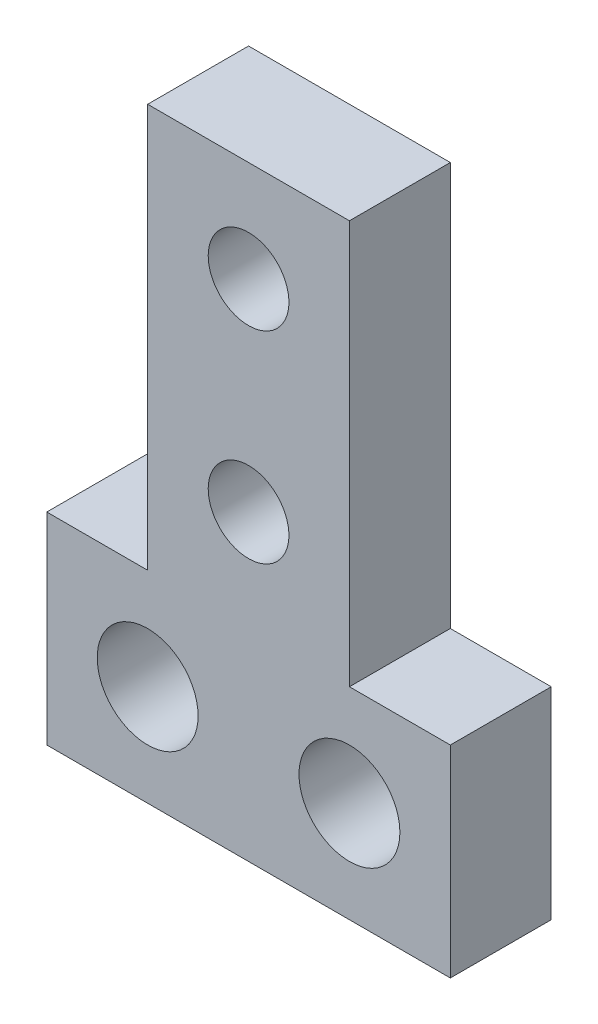
ISO-10303-21;
HEADER;
FILE_DESCRIPTION(('STEP AP214'),'2;1');
FILE_NAME('part.step','',(''),(''),'','','');
FILE_SCHEMA(('AUTOMOTIVE_DESIGN { 1 0 10303 214 1 1 1 1 }'));
ENDSEC;
DATA;
#1=APPLICATION_CONTEXT('core data for automotive mechanical design processes');
#2=APPLICATION_PROTOCOL_DEFINITION('international standard','automotive_design',2000,#1);
#3=PRODUCT_CONTEXT('',#1,'mechanical');
#4=PRODUCT('Part','Part','',(#3));
#5=PRODUCT_RELATED_PRODUCT_CATEGORY('part','',(#4));
#6=PRODUCT_DEFINITION_FORMATION('','',#4);
#7=PRODUCT_DEFINITION_CONTEXT('part definition',#1,'design');
#8=PRODUCT_DEFINITION('design','',#6,#7);
#9=PRODUCT_DEFINITION_SHAPE('','',#8);
#10=(LENGTH_UNIT() NAMED_UNIT(*) SI_UNIT(.MILLI.,.METRE.));
#11=(NAMED_UNIT(*) PLANE_ANGLE_UNIT() SI_UNIT($,.RADIAN.));
#12=(NAMED_UNIT(*) SI_UNIT($,.STERADIAN.) SOLID_ANGLE_UNIT());
#13=UNCERTAINTY_MEASURE_WITH_UNIT(LENGTH_MEASURE(1.E-05),#10,'distance_accuracy_value','');
#14=(GEOMETRIC_REPRESENTATION_CONTEXT(3) GLOBAL_UNCERTAINTY_ASSIGNED_CONTEXT((#13)) GLOBAL_UNIT_ASSIGNED_CONTEXT((#10,
#11,#12)) REPRESENTATION_CONTEXT('',''));
#15=CARTESIAN_POINT('',(0.,0.,0.));
#16=DIRECTION('',(0.,0.,1.));
#17=DIRECTION('',(1.,0.,0.));
#18=AXIS2_PLACEMENT_3D('',#15,#16,#17);
#19=CARTESIAN_POINT('',(10.,5.,5.));
#20=DIRECTION('',(0.,-1.,0.));
#21=DIRECTION('',(1.,0.,0.));
#22=AXIS2_PLACEMENT_3D('',#19,#20,#21);
#23=PLANE('',#22);
#24=DIRECTION('',(0.,0.,-1.));
#25=VECTOR('',#24,1.);
#26=CARTESIAN_POINT('',(5.,5.,5.));
#27=LINE('',#26,#25);
#28=CARTESIAN_POINT('',(5.,5.,5.));
#29=VERTEX_POINT('',#28);
#30=CARTESIAN_POINT('',(5.,5.,0.));
#31=VERTEX_POINT('',#30);
#32=EDGE_CURVE('E141',#29,#31,#27,.T.);
#33=ORIENTED_EDGE('',*,*,#32,.F.);
#34=DIRECTION('',(-1.,0.,0.));
#35=VECTOR('',#34,1.);
#36=CARTESIAN_POINT('',(10.,5.,5.));
#37=LINE('',#36,#35);
#38=CARTESIAN_POINT('',(10.,5.,5.));
#39=VERTEX_POINT('',#38);
#40=EDGE_CURVE('E162',#39,#29,#37,.T.);
#41=ORIENTED_EDGE('',*,*,#40,.F.);
#42=DIRECTION('',(0.,0.,-1.));
#43=VECTOR('',#42,1.);
#44=CARTESIAN_POINT('',(10.,5.,5.));
#45=LINE('',#44,#43);
#46=CARTESIAN_POINT('',(10.,5.,0.));
#47=VERTEX_POINT('',#46);
#48=EDGE_CURVE('E174',#39,#47,#45,.T.);
#49=ORIENTED_EDGE('',*,*,#48,.T.);
#50=DIRECTION('',(-1.,0.,0.));
#51=VECTOR('',#50,1.);
#52=CARTESIAN_POINT('',(10.,5.,0.));
#53=LINE('',#52,#51);
#54=EDGE_CURVE('E158',#47,#31,#53,.T.);
#55=ORIENTED_EDGE('',*,*,#54,.T.);
#56=EDGE_LOOP('',(#33,#41,#49,#55));
#57=FACE_BOUND('',#56,.T.);
#58=ADVANCED_FACE('F35',(#57),#23,.F.);
#59=CARTESIAN_POINT('',(0.,0.,5.));
#60=DIRECTION('',(0.,0.,1.));
#61=DIRECTION('',(1.,0.,0.));
#62=AXIS2_PLACEMENT_3D('',#59,#60,#61);
#63=PLANE('',#62);
#64=CARTESIAN_POINT('',(-5.,0.,5.));
#65=DIRECTION('',(0.,0.,1.));
#66=DIRECTION('',(1.,0.,0.));
#67=AXIS2_PLACEMENT_3D('',#64,#65,#66);
#68=CIRCLE('',#67,2.5);
#69=CARTESIAN_POINT('',(-2.5,0.,5.));
#70=VERTEX_POINT('',#69);
#71=EDGE_CURVE('E150',#70,#70,#68,.T.);
#72=ORIENTED_EDGE('',*,*,#71,.F.);
#73=EDGE_LOOP('',(#72));
#74=FACE_BOUND('',#73,.T.);
#75=DIRECTION('',(0.,-1.,0.));
#76=VECTOR('',#75,1.);
#77=CARTESIAN_POINT('',(-9.99999999999999,-5.,5.));
#78=LINE('',#77,#76);
#79=CARTESIAN_POINT('',(-9.99999999999999,5.,5.));
#80=VERTEX_POINT('',#79);
#81=CARTESIAN_POINT('',(-9.99999999999999,-5.,5.));
#82=VERTEX_POINT('',#81);
#83=EDGE_CURVE('E156',#80,#82,#78,.T.);
#84=ORIENTED_EDGE('',*,*,#83,.T.);
#85=DIRECTION('',(1.,0.,0.));
#86=VECTOR('',#85,1.);
#87=CARTESIAN_POINT('',(10.,-5.,5.));
#88=LINE('',#87,#86);
#89=CARTESIAN_POINT('',(10.,-5.,5.));
#90=VERTEX_POINT('',#89);
#91=EDGE_CURVE('E87',#82,#90,#88,.T.);
#92=ORIENTED_EDGE('',*,*,#91,.T.);
#93=DIRECTION('',(0.,1.,0.));
#94=VECTOR('',#93,1.);
#95=CARTESIAN_POINT('',(10.,-5.,5.));
#96=LINE('',#95,#94);
#97=EDGE_CURVE('E160',#90,#39,#96,.T.);
#98=ORIENTED_EDGE('',*,*,#97,.T.);
#99=ORIENTED_EDGE('',*,*,#40,.T.);
#100=DIRECTION('',(0.,-1.,0.));
#101=VECTOR('',#100,1.);
#102=CARTESIAN_POINT('',(5.,5.,5.));
#103=LINE('',#102,#101);
#104=CARTESIAN_POINT('',(5.,25.,5.));
#105=VERTEX_POINT('',#104);
#106=EDGE_CURVE('E117',#105,#29,#103,.T.);
#107=ORIENTED_EDGE('',*,*,#106,.F.);
#108=DIRECTION('',(1.,0.,0.));
#109=VECTOR('',#108,1.);
#110=CARTESIAN_POINT('',(-5.,25.,5.));
#111=LINE('',#110,#109);
#112=CARTESIAN_POINT('',(-5.,25.,5.));
#113=VERTEX_POINT('',#112);
#114=EDGE_CURVE('E112',#113,#105,#111,.T.);
#115=ORIENTED_EDGE('',*,*,#114,.F.);
#116=DIRECTION('',(0.,1.,0.));
#117=VECTOR('',#116,1.);
#118=CARTESIAN_POINT('',(-5.,5.,5.));
#119=LINE('',#118,#117);
#120=CARTESIAN_POINT('',(-5.,5.,5.));
#121=VERTEX_POINT('',#120);
#122=EDGE_CURVE('E122',#121,#113,#119,.T.);
#123=ORIENTED_EDGE('',*,*,#122,.F.);
#124=EDGE_CURVE('E59',#121,#80,#37,.T.);
#125=ORIENTED_EDGE('',*,*,#124,.T.);
#126=EDGE_LOOP('',(#84,#92,#98,#99,#107,#115,#123,#125));
#127=FACE_BOUND('',#126,.T.);
#128=CARTESIAN_POINT('',(5.,0.,5.));
#129=DIRECTION('',(0.,0.,1.));
#130=DIRECTION('',(1.,0.,0.));
#131=AXIS2_PLACEMENT_3D('',#128,#129,#130);
#132=CIRCLE('',#131,2.5);
#133=CARTESIAN_POINT('',(7.5,0.,5.));
#134=VERTEX_POINT('',#133);
#135=EDGE_CURVE('E144',#134,#134,#132,.T.);
#136=ORIENTED_EDGE('',*,*,#135,.F.);
#137=EDGE_LOOP('',(#136));
#138=FACE_BOUND('',#137,.T.);
#139=CARTESIAN_POINT('',(0.,10.,5.));
#140=DIRECTION('',(0.,0.,-1.));
#141=DIRECTION('',(-1.,0.,0.));
#142=AXIS2_PLACEMENT_3D('',#139,#140,#141);
#143=CIRCLE('',#142,2.);
#144=CARTESIAN_POINT('',(-2.,10.,5.));
#145=VERTEX_POINT('',#144);
#146=EDGE_CURVE('E323',#145,#145,#143,.T.);
#147=ORIENTED_EDGE('',*,*,#146,.T.);
#148=EDGE_LOOP('',(#147));
#149=FACE_BOUND('',#148,.T.);
#150=CARTESIAN_POINT('',(0.,20.,5.));
#151=DIRECTION('',(0.,0.,-1.));
#152=DIRECTION('',(-1.,0.,0.));
#153=AXIS2_PLACEMENT_3D('',#150,#151,#152);
#154=CIRCLE('',#153,2.);
#155=CARTESIAN_POINT('',(-2.,20.,5.));
#156=VERTEX_POINT('',#155);
#157=EDGE_CURVE('E137',#156,#156,#154,.T.);
#158=ORIENTED_EDGE('',*,*,#157,.T.);
#159=EDGE_LOOP('',(#158));
#160=FACE_BOUND('',#159,.T.);
#161=ADVANCED_FACE('F120',(#74,#127,#138,#149,#160),#63,.T.);
#162=CARTESIAN_POINT('',(0.,0.,0.));
#163=DIRECTION('',(0.,0.,1.));
#164=DIRECTION('',(1.,0.,0.));
#165=AXIS2_PLACEMENT_3D('',#162,#163,#164);
#166=PLANE('',#165);
#167=DIRECTION('',(0.,-1.,0.));
#168=VECTOR('',#167,1.);
#169=CARTESIAN_POINT('',(-9.99999999999999,-5.,0.));
#170=LINE('',#169,#168);
#171=CARTESIAN_POINT('',(-9.99999999999999,5.,0.));
#172=VERTEX_POINT('',#171);
#173=CARTESIAN_POINT('',(-9.99999999999999,-5.,0.));
#174=VERTEX_POINT('',#173);
#175=EDGE_CURVE('E153',#172,#174,#170,.T.);
#176=ORIENTED_EDGE('',*,*,#175,.F.);
#177=CARTESIAN_POINT('',(-5.,5.,0.));
#178=VERTEX_POINT('',#177);
#179=EDGE_CURVE('E80',#178,#172,#53,.T.);
#180=ORIENTED_EDGE('',*,*,#179,.F.);
#181=DIRECTION('',(0.,1.,0.));
#182=VECTOR('',#181,1.);
#183=CARTESIAN_POINT('',(-5.,5.,0.));
#184=LINE('',#183,#182);
#185=CARTESIAN_POINT('',(-5.,25.,0.));
#186=VERTEX_POINT('',#185);
#187=EDGE_CURVE('E50',#178,#186,#184,.T.);
#188=ORIENTED_EDGE('',*,*,#187,.T.);
#189=DIRECTION('',(1.,0.,0.));
#190=VECTOR('',#189,1.);
#191=CARTESIAN_POINT('',(-5.,25.,0.));
#192=LINE('',#191,#190);
#193=CARTESIAN_POINT('',(5.,25.,0.));
#194=VERTEX_POINT('',#193);
#195=EDGE_CURVE('E114',#186,#194,#192,.T.);
#196=ORIENTED_EDGE('',*,*,#195,.T.);
#197=DIRECTION('',(0.,-1.,0.));
#198=VECTOR('',#197,1.);
#199=CARTESIAN_POINT('',(5.,5.,0.));
#200=LINE('',#199,#198);
#201=EDGE_CURVE('E127',#194,#31,#200,.T.);
#202=ORIENTED_EDGE('',*,*,#201,.T.);
#203=ORIENTED_EDGE('',*,*,#54,.F.);
#204=DIRECTION('',(0.,1.,0.));
#205=VECTOR('',#204,1.);
#206=CARTESIAN_POINT('',(10.,-5.,0.));
#207=LINE('',#206,#205);
#208=CARTESIAN_POINT('',(10.,-5.,0.));
#209=VERTEX_POINT('',#208);
#210=EDGE_CURVE('E169',#209,#47,#207,.T.);
#211=ORIENTED_EDGE('',*,*,#210,.F.);
#212=DIRECTION('',(1.,0.,0.));
#213=VECTOR('',#212,1.);
#214=CARTESIAN_POINT('',(10.,-5.,0.));
#215=LINE('',#214,#213);
#216=EDGE_CURVE('E167',#174,#209,#215,.T.);
#217=ORIENTED_EDGE('',*,*,#216,.F.);
#218=EDGE_LOOP('',(#176,#180,#188,#196,#202,#203,#211,#217));
#219=FACE_BOUND('',#218,.T.);
#220=CARTESIAN_POINT('',(-5.,0.,0.));
#221=DIRECTION('',(0.,0.,1.));
#222=DIRECTION('',(1.,0.,0.));
#223=AXIS2_PLACEMENT_3D('',#220,#221,#222);
#224=CIRCLE('',#223,2.5);
#225=CARTESIAN_POINT('',(-2.5,0.,0.));
#226=VERTEX_POINT('',#225);
#227=EDGE_CURVE('E147',#226,#226,#224,.T.);
#228=ORIENTED_EDGE('',*,*,#227,.T.);
#229=EDGE_LOOP('',(#228));
#230=FACE_BOUND('',#229,.T.);
#231=CARTESIAN_POINT('',(5.,0.,0.));
#232=DIRECTION('',(0.,0.,1.));
#233=DIRECTION('',(1.,0.,0.));
#234=AXIS2_PLACEMENT_3D('',#231,#232,#233);
#235=CIRCLE('',#234,2.5);
#236=CARTESIAN_POINT('',(7.5,0.,0.));
#237=VERTEX_POINT('',#236);
#238=EDGE_CURVE('E140',#237,#237,#235,.T.);
#239=ORIENTED_EDGE('',*,*,#238,.T.);
#240=EDGE_LOOP('',(#239));
#241=FACE_BOUND('',#240,.T.);
#242=CARTESIAN_POINT('',(0.,10.,0.));
#243=DIRECTION('',(0.,0.,-1.));
#244=DIRECTION('',(-1.,0.,0.));
#245=AXIS2_PLACEMENT_3D('',#242,#243,#244);
#246=CIRCLE('',#245,2.);
#247=CARTESIAN_POINT('',(-2.,10.,0.));
#248=VERTEX_POINT('',#247);
#249=EDGE_CURVE('E326',#248,#248,#246,.T.);
#250=ORIENTED_EDGE('',*,*,#249,.F.);
#251=EDGE_LOOP('',(#250));
#252=FACE_BOUND('',#251,.T.);
#253=CARTESIAN_POINT('',(0.,20.,0.));
#254=DIRECTION('',(0.,0.,-1.));
#255=DIRECTION('',(-1.,0.,0.));
#256=AXIS2_PLACEMENT_3D('',#253,#254,#255);
#257=CIRCLE('',#256,2.);
#258=CARTESIAN_POINT('',(-2.,20.,0.));
#259=VERTEX_POINT('',#258);
#260=EDGE_CURVE('E132',#259,#259,#257,.T.);
#261=ORIENTED_EDGE('',*,*,#260,.F.);
#262=EDGE_LOOP('',(#261));
#263=FACE_BOUND('',#262,.T.);
#264=ADVANCED_FACE('F185',(#219,#230,#241,#252,#263),#166,.F.);
#265=CARTESIAN_POINT('',(-9.99999999999999,-5.,5.));
#266=DIRECTION('',(1.,0.,0.));
#267=DIRECTION('',(0.,0.,-1.));
#268=AXIS2_PLACEMENT_3D('',#265,#266,#267);
#269=PLANE('',#268);
#270=ORIENTED_EDGE('',*,*,#175,.T.);
#271=DIRECTION('',(0.,0.,-1.));
#272=VECTOR('',#271,1.);
#273=CARTESIAN_POINT('',(-9.99999999999999,-5.,5.));
#274=LINE('',#273,#272);
#275=EDGE_CURVE('E11',#82,#174,#274,.T.);
#276=ORIENTED_EDGE('',*,*,#275,.F.);
#277=ORIENTED_EDGE('',*,*,#83,.F.);
#278=DIRECTION('',(0.,0.,-1.));
#279=VECTOR('',#278,1.);
#280=CARTESIAN_POINT('',(-9.99999999999999,5.,5.));
#281=LINE('',#280,#279);
#282=EDGE_CURVE('E164',#80,#172,#281,.T.);
#283=ORIENTED_EDGE('',*,*,#282,.T.);
#284=EDGE_LOOP('',(#270,#276,#277,#283));
#285=FACE_BOUND('',#284,.T.);
#286=ADVANCED_FACE('F37',(#285),#269,.F.);
#287=CARTESIAN_POINT('',(10.,-5.,5.));
#288=DIRECTION('',(0.,1.,0.));
#289=DIRECTION('',(-1.,0.,0.));
#290=AXIS2_PLACEMENT_3D('',#287,#288,#289);
#291=PLANE('',#290);
#292=ORIENTED_EDGE('',*,*,#216,.T.);
#293=DIRECTION('',(0.,0.,-1.));
#294=VECTOR('',#293,1.);
#295=CARTESIAN_POINT('',(10.,-5.,5.));
#296=LINE('',#295,#294);
#297=EDGE_CURVE('E43',#90,#209,#296,.T.);
#298=ORIENTED_EDGE('',*,*,#297,.F.);
#299=ORIENTED_EDGE('',*,*,#91,.F.);
#300=ORIENTED_EDGE('',*,*,#275,.T.);
#301=EDGE_LOOP('',(#292,#298,#299,#300));
#302=FACE_BOUND('',#301,.T.);
#303=ADVANCED_FACE('F194',(#302),#291,.F.);
#304=CARTESIAN_POINT('',(10.,-5.,5.));
#305=DIRECTION('',(-1.,0.,0.));
#306=DIRECTION('',(0.,0.,1.));
#307=AXIS2_PLACEMENT_3D('',#304,#305,#306);
#308=PLANE('',#307);
#309=ORIENTED_EDGE('',*,*,#210,.T.);
#310=ORIENTED_EDGE('',*,*,#48,.F.);
#311=ORIENTED_EDGE('',*,*,#97,.F.);
#312=ORIENTED_EDGE('',*,*,#297,.T.);
#313=EDGE_LOOP('',(#309,#310,#311,#312));
#314=FACE_BOUND('',#313,.T.);
#315=ADVANCED_FACE('F180',(#314),#308,.F.);
#316=ORIENTED_EDGE('',*,*,#124,.F.);
#317=DIRECTION('',(0.,0.,-1.));
#318=VECTOR('',#317,1.);
#319=CARTESIAN_POINT('',(-5.,5.,5.));
#320=LINE('',#319,#318);
#321=EDGE_CURVE('E126',#121,#178,#320,.T.);
#322=ORIENTED_EDGE('',*,*,#321,.T.);
#323=ORIENTED_EDGE('',*,*,#179,.T.);
#324=ORIENTED_EDGE('',*,*,#282,.F.);
#325=EDGE_LOOP('',(#316,#322,#323,#324));
#326=FACE_BOUND('',#325,.T.);
#327=ADVANCED_FACE('F200',(#326),#23,.F.);
#328=CARTESIAN_POINT('',(-5.,0.,5.));
#329=DIRECTION('',(0.,0.,-1.));
#330=DIRECTION('',(-1.,0.,0.));
#331=AXIS2_PLACEMENT_3D('',#328,#329,#330);
#332=CYLINDRICAL_SURFACE('',#331,2.5);
#333=ORIENTED_EDGE('',*,*,#71,.T.);
#334=EDGE_LOOP('',(#333));
#335=FACE_BOUND('',#334,.T.);
#336=ORIENTED_EDGE('',*,*,#227,.F.);
#337=EDGE_LOOP('',(#336));
#338=FACE_BOUND('',#337,.T.);
#339=ADVANCED_FACE('F211',(#335,#338),#332,.F.);
#340=CARTESIAN_POINT('',(5.,0.,5.));
#341=DIRECTION('',(0.,0.,-1.));
#342=DIRECTION('',(-1.,0.,0.));
#343=AXIS2_PLACEMENT_3D('',#340,#341,#342);
#344=CYLINDRICAL_SURFACE('',#343,2.5);
#345=ORIENTED_EDGE('',*,*,#135,.T.);
#346=EDGE_LOOP('',(#345));
#347=FACE_BOUND('',#346,.T.);
#348=ORIENTED_EDGE('',*,*,#238,.F.);
#349=EDGE_LOOP('',(#348));
#350=FACE_BOUND('',#349,.T.);
#351=ADVANCED_FACE('F215',(#347,#350),#344,.F.);
#352=CARTESIAN_POINT('',(-5.,5.,5.));
#353=DIRECTION('',(-1.,0.,0.));
#354=DIRECTION('',(0.,0.,1.));
#355=AXIS2_PLACEMENT_3D('',#352,#353,#354);
#356=PLANE('',#355);
#357=ORIENTED_EDGE('',*,*,#187,.F.);
#358=ORIENTED_EDGE('',*,*,#321,.F.);
#359=ORIENTED_EDGE('',*,*,#122,.T.);
#360=DIRECTION('',(0.,0.,-1.));
#361=VECTOR('',#360,1.);
#362=CARTESIAN_POINT('',(-5.,25.,5.));
#363=LINE('',#362,#361);
#364=EDGE_CURVE('E109',#113,#186,#363,.T.);
#365=ORIENTED_EDGE('',*,*,#364,.T.);
#366=EDGE_LOOP('',(#357,#358,#359,#365));
#367=FACE_BOUND('',#366,.T.);
#368=ADVANCED_FACE('F125',(#367),#356,.T.);
#369=CARTESIAN_POINT('',(5.,5.,5.));
#370=DIRECTION('',(1.,0.,0.));
#371=DIRECTION('',(0.,0.,-1.));
#372=AXIS2_PLACEMENT_3D('',#369,#370,#371);
#373=PLANE('',#372);
#374=ORIENTED_EDGE('',*,*,#201,.F.);
#375=DIRECTION('',(0.,0.,-1.));
#376=VECTOR('',#375,1.);
#377=CARTESIAN_POINT('',(5.,25.,5.));
#378=LINE('',#377,#376);
#379=EDGE_CURVE('E116',#105,#194,#378,.T.);
#380=ORIENTED_EDGE('',*,*,#379,.F.);
#381=ORIENTED_EDGE('',*,*,#106,.T.);
#382=ORIENTED_EDGE('',*,*,#32,.T.);
#383=EDGE_LOOP('',(#374,#380,#381,#382));
#384=FACE_BOUND('',#383,.T.);
#385=ADVANCED_FACE('F281',(#384),#373,.T.);
#386=CARTESIAN_POINT('',(-5.,25.,5.));
#387=DIRECTION('',(0.,1.,0.));
#388=DIRECTION('',(0.,0.,1.));
#389=AXIS2_PLACEMENT_3D('',#386,#387,#388);
#390=PLANE('',#389);
#391=ORIENTED_EDGE('',*,*,#195,.F.);
#392=ORIENTED_EDGE('',*,*,#364,.F.);
#393=ORIENTED_EDGE('',*,*,#114,.T.);
#394=ORIENTED_EDGE('',*,*,#379,.T.);
#395=EDGE_LOOP('',(#391,#392,#393,#394));
#396=FACE_BOUND('',#395,.T.);
#397=ADVANCED_FACE('F111',(#396),#390,.T.);
#398=CARTESIAN_POINT('',(0.,20.,5.));
#399=DIRECTION('',(0.,0.,-1.));
#400=DIRECTION('',(-1.,0.,0.));
#401=AXIS2_PLACEMENT_3D('',#398,#399,#400);
#402=CYLINDRICAL_SURFACE('',#401,2.);
#403=ORIENTED_EDGE('',*,*,#157,.F.);
#404=EDGE_LOOP('',(#403));
#405=FACE_BOUND('',#404,.T.);
#406=ORIENTED_EDGE('',*,*,#260,.T.);
#407=EDGE_LOOP('',(#406));
#408=FACE_BOUND('',#407,.T.);
#409=ADVANCED_FACE('F296',(#405,#408),#402,.F.);
#410=CARTESIAN_POINT('',(0.,10.,5.));
#411=DIRECTION('',(0.,0.,-1.));
#412=DIRECTION('',(-1.,0.,0.));
#413=AXIS2_PLACEMENT_3D('',#410,#411,#412);
#414=CYLINDRICAL_SURFACE('',#413,2.);
#415=ORIENTED_EDGE('',*,*,#146,.F.);
#416=EDGE_LOOP('',(#415));
#417=FACE_BOUND('',#416,.T.);
#418=ORIENTED_EDGE('',*,*,#249,.T.);
#419=EDGE_LOOP('',(#418));
#420=FACE_BOUND('',#419,.T.);
#421=ADVANCED_FACE('F304',(#417,#420),#414,.F.);
#422=CLOSED_SHELL('',(#58,#161,#264,#286,#303,#315,#327,#339,#351,#368,#385,#397,#409,#421));
#423=MANIFOLD_SOLID_BREP('B2',#422);
#424=ADVANCED_BREP_SHAPE_REPRESENTATION('',(#18,#423),#14);
#425=SHAPE_DEFINITION_REPRESENTATION(#9,#424);
ENDSEC;
END-ISO-10303-21;
